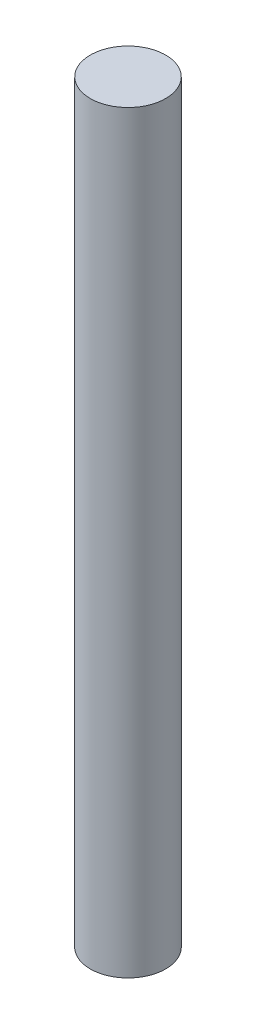
ISO-10303-21;
HEADER;
FILE_DESCRIPTION(('STEP AP214'),'2;1');
FILE_NAME('part.step','',(''),(''),'','','');
FILE_SCHEMA(('AUTOMOTIVE_DESIGN { 1 0 10303 214 1 1 1 1 }'));
ENDSEC;
DATA;
#1=APPLICATION_CONTEXT('core data for automotive mechanical design processes');
#2=APPLICATION_PROTOCOL_DEFINITION('international standard','automotive_design',2000,#1);
#3=PRODUCT_CONTEXT('',#1,'mechanical');
#4=PRODUCT('Part','Part','',(#3));
#5=PRODUCT_RELATED_PRODUCT_CATEGORY('part','',(#4));
#6=PRODUCT_DEFINITION_FORMATION('','',#4);
#7=PRODUCT_DEFINITION_CONTEXT('part definition',#1,'design');
#8=PRODUCT_DEFINITION('design','',#6,#7);
#9=PRODUCT_DEFINITION_SHAPE('','',#8);
#10=(LENGTH_UNIT() NAMED_UNIT(*) SI_UNIT(.MILLI.,.METRE.));
#11=(NAMED_UNIT(*) PLANE_ANGLE_UNIT() SI_UNIT($,.RADIAN.));
#12=(NAMED_UNIT(*) SI_UNIT($,.STERADIAN.) SOLID_ANGLE_UNIT());
#13=UNCERTAINTY_MEASURE_WITH_UNIT(LENGTH_MEASURE(1.E-05),#10,'distance_accuracy_value','');
#14=(GEOMETRIC_REPRESENTATION_CONTEXT(3) GLOBAL_UNCERTAINTY_ASSIGNED_CONTEXT((#13)) GLOBAL_UNIT_ASSIGNED_CONTEXT((#10,
#11,#12)) REPRESENTATION_CONTEXT('',''));
#15=CARTESIAN_POINT('',(0.,0.,0.));
#16=DIRECTION('',(0.,0.,1.));
#17=DIRECTION('',(1.,0.,0.));
#18=AXIS2_PLACEMENT_3D('',#15,#16,#17);
#19=CARTESIAN_POINT('',(0.,170.,0.));
#20=DIRECTION('',(0.,-1.,0.));
#21=DIRECTION('',(0.,0.,-1.));
#22=AXIS2_PLACEMENT_3D('',#19,#20,#21);
#23=CYLINDRICAL_SURFACE('',#22,8.49999999999999);
#24=CARTESIAN_POINT('',(0.,170.,0.));
#25=DIRECTION('',(0.,1.,0.));
#26=DIRECTION('',(0.,0.,1.));
#27=AXIS2_PLACEMENT_3D('',#24,#25,#26);
#28=CIRCLE('',#27,8.49999999999999);
#29=CARTESIAN_POINT('',(0.,170.,8.49999999999999));
#30=VERTEX_POINT('',#29);
#31=EDGE_CURVE('E10',#30,#30,#28,.T.);
#32=ORIENTED_EDGE('',*,*,#31,.F.);
#33=EDGE_LOOP('',(#32));
#34=FACE_BOUND('',#33,.T.);
#35=CARTESIAN_POINT('',(0.,0.,0.));
#36=DIRECTION('',(0.,1.,0.));
#37=DIRECTION('',(0.,0.,1.));
#38=AXIS2_PLACEMENT_3D('',#35,#36,#37);
#39=CIRCLE('',#38,8.49999999999999);
#40=CARTESIAN_POINT('',(0.,0.,8.49999999999999));
#41=VERTEX_POINT('',#40);
#42=EDGE_CURVE('E40',#41,#41,#39,.T.);
#43=ORIENTED_EDGE('',*,*,#42,.T.);
#44=EDGE_LOOP('',(#43));
#45=FACE_BOUND('',#44,.T.);
#46=ADVANCED_FACE('F37',(#34,#45),#23,.T.);
#47=CARTESIAN_POINT('',(0.,170.,0.));
#48=DIRECTION('',(0.,1.,0.));
#49=DIRECTION('',(0.,0.,1.));
#50=AXIS2_PLACEMENT_3D('',#47,#48,#49);
#51=PLANE('',#50);
#52=ORIENTED_EDGE('',*,*,#31,.T.);
#53=EDGE_LOOP('',(#52));
#54=FACE_BOUND('',#53,.T.);
#55=ADVANCED_FACE('F54',(#54),#51,.T.);
#56=CARTESIAN_POINT('',(0.,0.,0.));
#57=DIRECTION('',(0.,1.,0.));
#58=DIRECTION('',(0.,0.,1.));
#59=AXIS2_PLACEMENT_3D('',#56,#57,#58);
#60=PLANE('',#59);
#61=ORIENTED_EDGE('',*,*,#42,.F.);
#62=EDGE_LOOP('',(#61));
#63=FACE_BOUND('',#62,.T.);
#64=ADVANCED_FACE('F52',(#63),#60,.F.);
#65=CLOSED_SHELL('',(#46,#55,#64));
#66=MANIFOLD_SOLID_BREP('B2',#65);
#67=ADVANCED_BREP_SHAPE_REPRESENTATION('',(#18,#66),#14);
#68=SHAPE_DEFINITION_REPRESENTATION(#9,#67);
ENDSEC;
END-ISO-10303-21;
